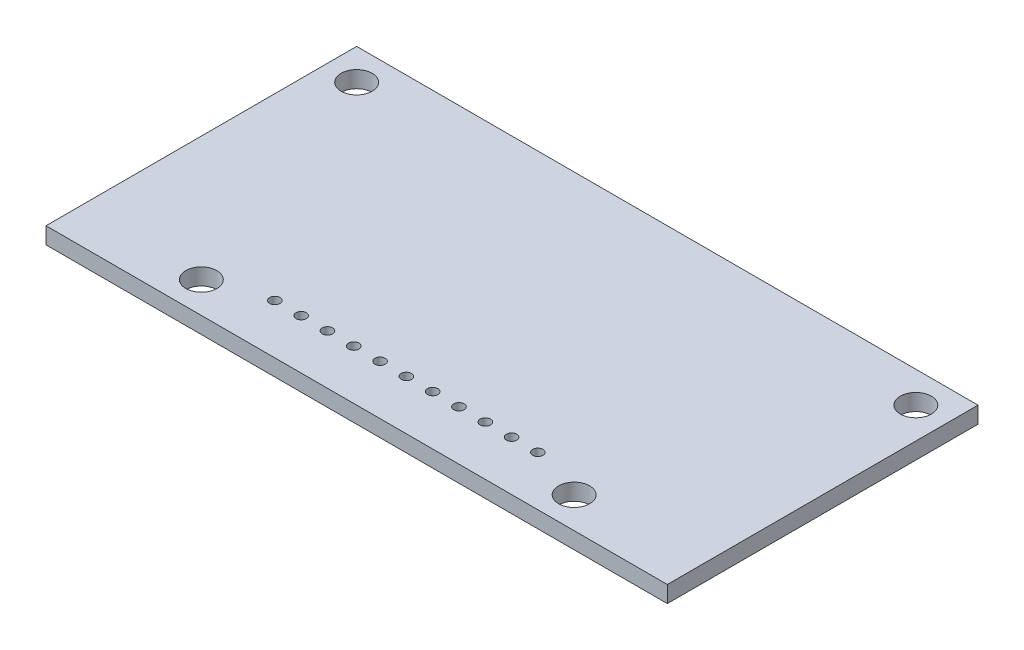
ISO-10303-21;
HEADER;
FILE_DESCRIPTION(('STEP AP214'),'2;1');
FILE_NAME('part.step','',(''),(''),'','','');
FILE_SCHEMA(('AUTOMOTIVE_DESIGN { 1 0 10303 214 1 1 1 1 }'));
ENDSEC;
DATA;
#1=APPLICATION_CONTEXT('core data for automotive mechanical design processes');
#2=APPLICATION_PROTOCOL_DEFINITION('international standard','automotive_design',2000,#1);
#3=PRODUCT_CONTEXT('',#1,'mechanical');
#4=PRODUCT('Part','Part','',(#3));
#5=PRODUCT_RELATED_PRODUCT_CATEGORY('part','',(#4));
#6=PRODUCT_DEFINITION_FORMATION('','',#4);
#7=PRODUCT_DEFINITION_CONTEXT('part definition',#1,'design');
#8=PRODUCT_DEFINITION('design','',#6,#7);
#9=PRODUCT_DEFINITION_SHAPE('','',#8);
#10=(LENGTH_UNIT() NAMED_UNIT(*) SI_UNIT(.MILLI.,.METRE.));
#11=(NAMED_UNIT(*) PLANE_ANGLE_UNIT() SI_UNIT($,.RADIAN.));
#12=(NAMED_UNIT(*) SI_UNIT($,.STERADIAN.) SOLID_ANGLE_UNIT());
#13=UNCERTAINTY_MEASURE_WITH_UNIT(LENGTH_MEASURE(1.E-05),#10,'distance_accuracy_value','');
#14=(GEOMETRIC_REPRESENTATION_CONTEXT(3) GLOBAL_UNCERTAINTY_ASSIGNED_CONTEXT((#13)) GLOBAL_UNIT_ASSIGNED_CONTEXT((#10,
#11,#12)) REPRESENTATION_CONTEXT('',''));
#15=CARTESIAN_POINT('',(0.,0.,0.));
#16=DIRECTION('',(0.,0.,1.));
#17=DIRECTION('',(1.,0.,0.));
#18=AXIS2_PLACEMENT_3D('',#15,#16,#17);
#19=CARTESIAN_POINT('',(0.,1.6,0.));
#20=DIRECTION('',(0.,-1.,0.));
#21=DIRECTION('',(0.,0.,-1.));
#22=AXIS2_PLACEMENT_3D('',#19,#20,#21);
#23=PLANE('',#22);
#24=DIRECTION('',(0.,0.,1.));
#25=VECTOR('',#24,1.);
#26=CARTESIAN_POINT('',(-30.,1.6,-15.));
#27=LINE('',#26,#25);
#28=CARTESIAN_POINT('',(-30.,1.6,-15.));
#29=VERTEX_POINT('',#28);
#30=CARTESIAN_POINT('',(-30.,1.6,15.));
#31=VERTEX_POINT('',#30);
#32=EDGE_CURVE('E94',#29,#31,#27,.T.);
#33=ORIENTED_EDGE('',*,*,#32,.T.);
#34=DIRECTION('',(1.,0.,0.));
#35=VECTOR('',#34,1.);
#36=CARTESIAN_POINT('',(30.,1.6,15.));
#37=LINE('',#36,#35);
#38=CARTESIAN_POINT('',(30.,1.6,15.));
#39=VERTEX_POINT('',#38);
#40=EDGE_CURVE('E89',#31,#39,#37,.T.);
#41=ORIENTED_EDGE('',*,*,#40,.T.);
#42=DIRECTION('',(0.,0.,-1.));
#43=VECTOR('',#42,1.);
#44=CARTESIAN_POINT('',(30.,1.6,-15.));
#45=LINE('',#44,#43);
#46=CARTESIAN_POINT('',(30.,1.6,-15.));
#47=VERTEX_POINT('',#46);
#48=EDGE_CURVE('E92',#39,#47,#45,.T.);
#49=ORIENTED_EDGE('',*,*,#48,.T.);
#50=DIRECTION('',(-1.,0.,0.));
#51=VECTOR('',#50,1.);
#52=CARTESIAN_POINT('',(30.,1.6,-15.));
#53=LINE('',#52,#51);
#54=EDGE_CURVE('E59',#47,#29,#53,.T.);
#55=ORIENTED_EDGE('',*,*,#54,.T.);
#56=EDGE_LOOP('',(#33,#41,#49,#55));
#57=FACE_BOUND('',#56,.T.);
#58=CARTESIAN_POINT('',(-27.,1.6,-12.));
#59=DIRECTION('',(0.,1.,0.));
#60=DIRECTION('',(0.,0.,1.));
#61=AXIS2_PLACEMENT_3D('',#58,#59,#60);
#62=CIRCLE('',#61,1.5);
#63=CARTESIAN_POINT('',(-27.,1.6,-10.5));
#64=VERTEX_POINT('',#63);
#65=EDGE_CURVE('E114',#64,#64,#62,.T.);
#66=ORIENTED_EDGE('',*,*,#65,.F.);
#67=EDGE_LOOP('',(#66));
#68=FACE_BOUND('',#67,.T.);
#69=CARTESIAN_POINT('',(-18.,1.6,12.));
#70=DIRECTION('',(0.,1.,0.));
#71=DIRECTION('',(0.,0.,1.));
#72=AXIS2_PLACEMENT_3D('',#69,#70,#71);
#73=CIRCLE('',#72,1.5);
#74=CARTESIAN_POINT('',(-18.,1.6,13.5));
#75=VERTEX_POINT('',#74);
#76=EDGE_CURVE('E136',#75,#75,#73,.T.);
#77=ORIENTED_EDGE('',*,*,#76,.F.);
#78=EDGE_LOOP('',(#77));
#79=FACE_BOUND('',#78,.T.);
#80=CARTESIAN_POINT('',(18.,1.6,12.));
#81=DIRECTION('',(0.,1.,0.));
#82=DIRECTION('',(0.,0.,1.));
#83=AXIS2_PLACEMENT_3D('',#80,#81,#82);
#84=CIRCLE('',#83,1.5);
#85=CARTESIAN_POINT('',(18.,1.6,13.5));
#86=VERTEX_POINT('',#85);
#87=EDGE_CURVE('E144',#86,#86,#84,.T.);
#88=ORIENTED_EDGE('',*,*,#87,.F.);
#89=EDGE_LOOP('',(#88));
#90=FACE_BOUND('',#89,.T.);
#91=CARTESIAN_POINT('',(27.,1.6,-12.));
#92=DIRECTION('',(0.,1.,0.));
#93=DIRECTION('',(0.,0.,1.));
#94=AXIS2_PLACEMENT_3D('',#91,#92,#93);
#95=CIRCLE('',#94,1.5);
#96=CARTESIAN_POINT('',(27.,1.6,-10.5));
#97=VERTEX_POINT('',#96);
#98=EDGE_CURVE('E152',#97,#97,#95,.T.);
#99=ORIENTED_EDGE('',*,*,#98,.F.);
#100=EDGE_LOOP('',(#99));
#101=FACE_BOUND('',#100,.T.);
#102=CARTESIAN_POINT('',(-12.7,1.6,10.2));
#103=DIRECTION('',(0.,1.,0.));
#104=DIRECTION('',(0.,0.,1.));
#105=AXIS2_PLACEMENT_3D('',#102,#103,#104);
#106=CIRCLE('',#105,0.500000000000001);
#107=CARTESIAN_POINT('',(-12.7,1.6,10.7));
#108=VERTEX_POINT('',#107);
#109=EDGE_CURVE('E160',#108,#108,#106,.T.);
#110=ORIENTED_EDGE('',*,*,#109,.F.);
#111=EDGE_LOOP('',(#110));
#112=FACE_BOUND('',#111,.T.);
#113=CARTESIAN_POINT('',(-10.16,1.6,10.2));
#114=DIRECTION('',(0.,1.,0.));
#115=DIRECTION('',(0.,0.,1.));
#116=AXIS2_PLACEMENT_3D('',#113,#114,#115);
#117=CIRCLE('',#116,0.500000000000001);
#118=CARTESIAN_POINT('',(-10.16,1.6,10.7));
#119=VERTEX_POINT('',#118);
#120=EDGE_CURVE('E168',#119,#119,#117,.T.);
#121=ORIENTED_EDGE('',*,*,#120,.F.);
#122=EDGE_LOOP('',(#121));
#123=FACE_BOUND('',#122,.T.);
#124=CARTESIAN_POINT('',(-7.62,1.6,10.2));
#125=DIRECTION('',(0.,1.,0.));
#126=DIRECTION('',(0.,0.,1.));
#127=AXIS2_PLACEMENT_3D('',#124,#125,#126);
#128=CIRCLE('',#127,0.500000000000002);
#129=CARTESIAN_POINT('',(-7.62,1.6,10.7));
#130=VERTEX_POINT('',#129);
#131=EDGE_CURVE('E176',#130,#130,#128,.T.);
#132=ORIENTED_EDGE('',*,*,#131,.F.);
#133=EDGE_LOOP('',(#132));
#134=FACE_BOUND('',#133,.T.);
#135=CARTESIAN_POINT('',(-5.08,1.6,10.2));
#136=DIRECTION('',(0.,1.,0.));
#137=DIRECTION('',(0.,0.,1.));
#138=AXIS2_PLACEMENT_3D('',#135,#136,#137);
#139=CIRCLE('',#138,0.500000000000001);
#140=CARTESIAN_POINT('',(-5.08,1.6,10.7));
#141=VERTEX_POINT('',#140);
#142=EDGE_CURVE('E184',#141,#141,#139,.T.);
#143=ORIENTED_EDGE('',*,*,#142,.F.);
#144=EDGE_LOOP('',(#143));
#145=FACE_BOUND('',#144,.T.);
#146=CARTESIAN_POINT('',(-2.54,1.6,10.2));
#147=DIRECTION('',(0.,1.,0.));
#148=DIRECTION('',(0.,0.,1.));
#149=AXIS2_PLACEMENT_3D('',#146,#147,#148);
#150=CIRCLE('',#149,0.5);
#151=CARTESIAN_POINT('',(-2.54,1.6,10.7));
#152=VERTEX_POINT('',#151);
#153=EDGE_CURVE('E192',#152,#152,#150,.T.);
#154=ORIENTED_EDGE('',*,*,#153,.F.);
#155=EDGE_LOOP('',(#154));
#156=FACE_BOUND('',#155,.T.);
#157=CARTESIAN_POINT('',(0.,1.6,10.2));
#158=DIRECTION('',(0.,1.,0.));
#159=DIRECTION('',(0.,0.,1.));
#160=AXIS2_PLACEMENT_3D('',#157,#158,#159);
#161=CIRCLE('',#160,0.5);
#162=CARTESIAN_POINT('',(0.,1.6,10.7));
#163=VERTEX_POINT('',#162);
#164=EDGE_CURVE('E200',#163,#163,#161,.T.);
#165=ORIENTED_EDGE('',*,*,#164,.F.);
#166=EDGE_LOOP('',(#165));
#167=FACE_BOUND('',#166,.T.);
#168=CARTESIAN_POINT('',(2.54,1.6,10.2));
#169=DIRECTION('',(0.,1.,0.));
#170=DIRECTION('',(0.,0.,1.));
#171=AXIS2_PLACEMENT_3D('',#168,#169,#170);
#172=CIRCLE('',#171,0.5);
#173=CARTESIAN_POINT('',(2.54,1.6,10.7));
#174=VERTEX_POINT('',#173);
#175=EDGE_CURVE('E208',#174,#174,#172,.T.);
#176=ORIENTED_EDGE('',*,*,#175,.F.);
#177=EDGE_LOOP('',(#176));
#178=FACE_BOUND('',#177,.T.);
#179=CARTESIAN_POINT('',(5.08,1.6,10.2));
#180=DIRECTION('',(0.,1.,0.));
#181=DIRECTION('',(0.,0.,1.));
#182=AXIS2_PLACEMENT_3D('',#179,#180,#181);
#183=CIRCLE('',#182,0.500000000000001);
#184=CARTESIAN_POINT('',(5.08,1.6,10.7));
#185=VERTEX_POINT('',#184);
#186=EDGE_CURVE('E216',#185,#185,#183,.T.);
#187=ORIENTED_EDGE('',*,*,#186,.F.);
#188=EDGE_LOOP('',(#187));
#189=FACE_BOUND('',#188,.T.);
#190=CARTESIAN_POINT('',(7.62,1.6,10.2));
#191=DIRECTION('',(0.,1.,0.));
#192=DIRECTION('',(0.,0.,1.));
#193=AXIS2_PLACEMENT_3D('',#190,#191,#192);
#194=CIRCLE('',#193,0.500000000000001);
#195=CARTESIAN_POINT('',(7.62,1.6,10.7));
#196=VERTEX_POINT('',#195);
#197=EDGE_CURVE('E224',#196,#196,#194,.T.);
#198=ORIENTED_EDGE('',*,*,#197,.F.);
#199=EDGE_LOOP('',(#198));
#200=FACE_BOUND('',#199,.T.);
#201=CARTESIAN_POINT('',(10.16,1.6,10.2));
#202=DIRECTION('',(0.,1.,0.));
#203=DIRECTION('',(0.,0.,1.));
#204=AXIS2_PLACEMENT_3D('',#201,#202,#203);
#205=CIRCLE('',#204,0.500000000000001);
#206=CARTESIAN_POINT('',(10.16,1.6,10.7));
#207=VERTEX_POINT('',#206);
#208=EDGE_CURVE('E232',#207,#207,#205,.T.);
#209=ORIENTED_EDGE('',*,*,#208,.F.);
#210=EDGE_LOOP('',(#209));
#211=FACE_BOUND('',#210,.T.);
#212=CARTESIAN_POINT('',(12.7,1.6,10.2));
#213=DIRECTION('',(0.,1.,0.));
#214=DIRECTION('',(0.,0.,1.));
#215=AXIS2_PLACEMENT_3D('',#212,#213,#214);
#216=CIRCLE('',#215,0.500000000000001);
#217=CARTESIAN_POINT('',(12.7,1.6,10.7));
#218=VERTEX_POINT('',#217);
#219=EDGE_CURVE('E240',#218,#218,#216,.T.);
#220=ORIENTED_EDGE('',*,*,#219,.F.);
#221=EDGE_LOOP('',(#220));
#222=FACE_BOUND('',#221,.T.);
#223=ADVANCED_FACE('F41',(#57,#68,#79,#90,#101,#112,#123,#134,#145,#156,#167,#178,#189,#200,
#211,#222),#23,.F.);
#224=CARTESIAN_POINT('',(0.,0.,0.));
#225=DIRECTION('',(0.,-1.,0.));
#226=DIRECTION('',(0.,0.,-1.));
#227=AXIS2_PLACEMENT_3D('',#224,#225,#226);
#228=PLANE('',#227);
#229=CARTESIAN_POINT('',(10.16,0.,10.2));
#230=DIRECTION('',(0.,1.,0.));
#231=DIRECTION('',(0.,0.,1.));
#232=AXIS2_PLACEMENT_3D('',#229,#230,#231);
#233=CIRCLE('',#232,0.500000000000001);
#234=CARTESIAN_POINT('',(10.16,0.,10.7));
#235=VERTEX_POINT('',#234);
#236=EDGE_CURVE('E236',#235,#235,#233,.T.);
#237=ORIENTED_EDGE('',*,*,#236,.T.);
#238=EDGE_LOOP('',(#237));
#239=FACE_BOUND('',#238,.T.);
#240=CARTESIAN_POINT('',(5.08,0.,10.2));
#241=DIRECTION('',(0.,1.,0.));
#242=DIRECTION('',(0.,0.,1.));
#243=AXIS2_PLACEMENT_3D('',#240,#241,#242);
#244=CIRCLE('',#243,0.500000000000001);
#245=CARTESIAN_POINT('',(5.08,0.,10.7));
#246=VERTEX_POINT('',#245);
#247=EDGE_CURVE('E220',#246,#246,#244,.T.);
#248=ORIENTED_EDGE('',*,*,#247,.T.);
#249=EDGE_LOOP('',(#248));
#250=FACE_BOUND('',#249,.T.);
#251=CARTESIAN_POINT('',(0.,0.,10.2));
#252=DIRECTION('',(0.,1.,0.));
#253=DIRECTION('',(0.,0.,1.));
#254=AXIS2_PLACEMENT_3D('',#251,#252,#253);
#255=CIRCLE('',#254,0.5);
#256=CARTESIAN_POINT('',(0.,0.,10.7));
#257=VERTEX_POINT('',#256);
#258=EDGE_CURVE('E204',#257,#257,#255,.T.);
#259=ORIENTED_EDGE('',*,*,#258,.T.);
#260=EDGE_LOOP('',(#259));
#261=FACE_BOUND('',#260,.T.);
#262=CARTESIAN_POINT('',(-5.08,0.,10.2));
#263=DIRECTION('',(0.,1.,0.));
#264=DIRECTION('',(0.,0.,1.));
#265=AXIS2_PLACEMENT_3D('',#262,#263,#264);
#266=CIRCLE('',#265,0.500000000000001);
#267=CARTESIAN_POINT('',(-5.08,0.,10.7));
#268=VERTEX_POINT('',#267);
#269=EDGE_CURVE('E188',#268,#268,#266,.T.);
#270=ORIENTED_EDGE('',*,*,#269,.T.);
#271=EDGE_LOOP('',(#270));
#272=FACE_BOUND('',#271,.T.);
#273=CARTESIAN_POINT('',(-10.16,0.,10.2));
#274=DIRECTION('',(0.,1.,0.));
#275=DIRECTION('',(0.,0.,1.));
#276=AXIS2_PLACEMENT_3D('',#273,#274,#275);
#277=CIRCLE('',#276,0.500000000000001);
#278=CARTESIAN_POINT('',(-10.16,0.,10.7));
#279=VERTEX_POINT('',#278);
#280=EDGE_CURVE('E172',#279,#279,#277,.T.);
#281=ORIENTED_EDGE('',*,*,#280,.T.);
#282=EDGE_LOOP('',(#281));
#283=FACE_BOUND('',#282,.T.);
#284=CARTESIAN_POINT('',(27.,0.,-12.));
#285=DIRECTION('',(0.,1.,0.));
#286=DIRECTION('',(0.,0.,1.));
#287=AXIS2_PLACEMENT_3D('',#284,#285,#286);
#288=CIRCLE('',#287,1.5);
#289=CARTESIAN_POINT('',(27.,0.,-10.5));
#290=VERTEX_POINT('',#289);
#291=EDGE_CURVE('E156',#290,#290,#288,.T.);
#292=ORIENTED_EDGE('',*,*,#291,.T.);
#293=EDGE_LOOP('',(#292));
#294=FACE_BOUND('',#293,.T.);
#295=CARTESIAN_POINT('',(-18.,0.,12.));
#296=DIRECTION('',(0.,1.,0.));
#297=DIRECTION('',(0.,0.,1.));
#298=AXIS2_PLACEMENT_3D('',#295,#296,#297);
#299=CIRCLE('',#298,1.5);
#300=CARTESIAN_POINT('',(-18.,0.,13.5));
#301=VERTEX_POINT('',#300);
#302=EDGE_CURVE('E140',#301,#301,#299,.T.);
#303=ORIENTED_EDGE('',*,*,#302,.T.);
#304=EDGE_LOOP('',(#303));
#305=FACE_BOUND('',#304,.T.);
#306=DIRECTION('',(0.,0.,1.));
#307=VECTOR('',#306,1.);
#308=CARTESIAN_POINT('',(-30.,0.,-15.));
#309=LINE('',#308,#307);
#310=CARTESIAN_POINT('',(-30.,0.,-15.));
#311=VERTEX_POINT('',#310);
#312=CARTESIAN_POINT('',(-30.,0.,15.));
#313=VERTEX_POINT('',#312);
#314=EDGE_CURVE('E110',#311,#313,#309,.T.);
#315=ORIENTED_EDGE('',*,*,#314,.F.);
#316=DIRECTION('',(-1.,0.,0.));
#317=VECTOR('',#316,1.);
#318=CARTESIAN_POINT('',(30.,0.,-15.));
#319=LINE('',#318,#317);
#320=CARTESIAN_POINT('',(30.,0.,-15.));
#321=VERTEX_POINT('',#320);
#322=EDGE_CURVE('E82',#321,#311,#319,.T.);
#323=ORIENTED_EDGE('',*,*,#322,.F.);
#324=DIRECTION('',(0.,0.,-1.));
#325=VECTOR('',#324,1.);
#326=CARTESIAN_POINT('',(30.,0.,-15.));
#327=LINE('',#326,#325);
#328=CARTESIAN_POINT('',(30.,0.,15.));
#329=VERTEX_POINT('',#328);
#330=EDGE_CURVE('E76',#329,#321,#327,.T.);
#331=ORIENTED_EDGE('',*,*,#330,.F.);
#332=DIRECTION('',(1.,0.,0.));
#333=VECTOR('',#332,1.);
#334=CARTESIAN_POINT('',(30.,0.,15.));
#335=LINE('',#334,#333);
#336=EDGE_CURVE('E99',#313,#329,#335,.T.);
#337=ORIENTED_EDGE('',*,*,#336,.F.);
#338=EDGE_LOOP('',(#315,#323,#331,#337));
#339=FACE_BOUND('',#338,.T.);
#340=CARTESIAN_POINT('',(-27.,0.,-12.));
#341=DIRECTION('',(0.,1.,0.));
#342=DIRECTION('',(0.,0.,1.));
#343=AXIS2_PLACEMENT_3D('',#340,#341,#342);
#344=CIRCLE('',#343,1.5);
#345=CARTESIAN_POINT('',(-27.,0.,-10.5));
#346=VERTEX_POINT('',#345);
#347=EDGE_CURVE('E132',#346,#346,#344,.T.);
#348=ORIENTED_EDGE('',*,*,#347,.T.);
#349=EDGE_LOOP('',(#348));
#350=FACE_BOUND('',#349,.T.);
#351=CARTESIAN_POINT('',(18.,0.,12.));
#352=DIRECTION('',(0.,1.,0.));
#353=DIRECTION('',(0.,0.,1.));
#354=AXIS2_PLACEMENT_3D('',#351,#352,#353);
#355=CIRCLE('',#354,1.5);
#356=CARTESIAN_POINT('',(18.,0.,13.5));
#357=VERTEX_POINT('',#356);
#358=EDGE_CURVE('E148',#357,#357,#355,.T.);
#359=ORIENTED_EDGE('',*,*,#358,.T.);
#360=EDGE_LOOP('',(#359));
#361=FACE_BOUND('',#360,.T.);
#362=CARTESIAN_POINT('',(-12.7,0.,10.2));
#363=DIRECTION('',(0.,1.,0.));
#364=DIRECTION('',(0.,0.,1.));
#365=AXIS2_PLACEMENT_3D('',#362,#363,#364);
#366=CIRCLE('',#365,0.500000000000001);
#367=CARTESIAN_POINT('',(-12.7,0.,10.7));
#368=VERTEX_POINT('',#367);
#369=EDGE_CURVE('E164',#368,#368,#366,.T.);
#370=ORIENTED_EDGE('',*,*,#369,.T.);
#371=EDGE_LOOP('',(#370));
#372=FACE_BOUND('',#371,.T.);
#373=CARTESIAN_POINT('',(-7.62,0.,10.2));
#374=DIRECTION('',(0.,1.,0.));
#375=DIRECTION('',(0.,0.,1.));
#376=AXIS2_PLACEMENT_3D('',#373,#374,#375);
#377=CIRCLE('',#376,0.500000000000002);
#378=CARTESIAN_POINT('',(-7.62,0.,10.7));
#379=VERTEX_POINT('',#378);
#380=EDGE_CURVE('E180',#379,#379,#377,.T.);
#381=ORIENTED_EDGE('',*,*,#380,.T.);
#382=EDGE_LOOP('',(#381));
#383=FACE_BOUND('',#382,.T.);
#384=CARTESIAN_POINT('',(-2.54,0.,10.2));
#385=DIRECTION('',(0.,1.,0.));
#386=DIRECTION('',(0.,0.,1.));
#387=AXIS2_PLACEMENT_3D('',#384,#385,#386);
#388=CIRCLE('',#387,0.5);
#389=CARTESIAN_POINT('',(-2.54,0.,10.7));
#390=VERTEX_POINT('',#389);
#391=EDGE_CURVE('E196',#390,#390,#388,.T.);
#392=ORIENTED_EDGE('',*,*,#391,.T.);
#393=EDGE_LOOP('',(#392));
#394=FACE_BOUND('',#393,.T.);
#395=CARTESIAN_POINT('',(2.54,0.,10.2));
#396=DIRECTION('',(0.,1.,0.));
#397=DIRECTION('',(0.,0.,1.));
#398=AXIS2_PLACEMENT_3D('',#395,#396,#397);
#399=CIRCLE('',#398,0.5);
#400=CARTESIAN_POINT('',(2.54,0.,10.7));
#401=VERTEX_POINT('',#400);
#402=EDGE_CURVE('E212',#401,#401,#399,.T.);
#403=ORIENTED_EDGE('',*,*,#402,.T.);
#404=EDGE_LOOP('',(#403));
#405=FACE_BOUND('',#404,.T.);
#406=CARTESIAN_POINT('',(7.62,0.,10.2));
#407=DIRECTION('',(0.,1.,0.));
#408=DIRECTION('',(0.,0.,1.));
#409=AXIS2_PLACEMENT_3D('',#406,#407,#408);
#410=CIRCLE('',#409,0.500000000000001);
#411=CARTESIAN_POINT('',(7.62,0.,10.7));
#412=VERTEX_POINT('',#411);
#413=EDGE_CURVE('E228',#412,#412,#410,.T.);
#414=ORIENTED_EDGE('',*,*,#413,.T.);
#415=EDGE_LOOP('',(#414));
#416=FACE_BOUND('',#415,.T.);
#417=CARTESIAN_POINT('',(12.7,0.,10.2));
#418=DIRECTION('',(0.,1.,0.));
#419=DIRECTION('',(0.,0.,1.));
#420=AXIS2_PLACEMENT_3D('',#417,#418,#419);
#421=CIRCLE('',#420,0.500000000000001);
#422=CARTESIAN_POINT('',(12.7,0.,10.7));
#423=VERTEX_POINT('',#422);
#424=EDGE_CURVE('E244',#423,#423,#421,.T.);
#425=ORIENTED_EDGE('',*,*,#424,.T.);
#426=EDGE_LOOP('',(#425));
#427=FACE_BOUND('',#426,.T.);
#428=ADVANCED_FACE('F127',(#239,#250,#261,#272,#283,#294,#305,#339,#350,#361,#372,#383,#394,
#405,#416,#427),#228,.T.);
#429=CARTESIAN_POINT('',(-30.,1.6,-15.));
#430=DIRECTION('',(1.,0.,0.));
#431=DIRECTION('',(0.,0.,-1.));
#432=AXIS2_PLACEMENT_3D('',#429,#430,#431);
#433=PLANE('',#432);
#434=ORIENTED_EDGE('',*,*,#314,.T.);
#435=DIRECTION('',(0.,-1.,0.));
#436=VECTOR('',#435,1.);
#437=CARTESIAN_POINT('',(-30.,1.6,15.));
#438=LINE('',#437,#436);
#439=EDGE_CURVE('E11',#31,#313,#438,.T.);
#440=ORIENTED_EDGE('',*,*,#439,.F.);
#441=ORIENTED_EDGE('',*,*,#32,.F.);
#442=DIRECTION('',(0.,-1.,0.));
#443=VECTOR('',#442,1.);
#444=CARTESIAN_POINT('',(-30.,1.6,-15.));
#445=LINE('',#444,#443);
#446=EDGE_CURVE('E106',#29,#311,#445,.T.);
#447=ORIENTED_EDGE('',*,*,#446,.T.);
#448=EDGE_LOOP('',(#434,#440,#441,#447));
#449=FACE_BOUND('',#448,.T.);
#450=ADVANCED_FACE('F43',(#449),#433,.F.);
#451=CARTESIAN_POINT('',(30.,1.6,15.));
#452=DIRECTION('',(0.,0.,-1.));
#453=DIRECTION('',(-1.,0.,0.));
#454=AXIS2_PLACEMENT_3D('',#451,#452,#453);
#455=PLANE('',#454);
#456=ORIENTED_EDGE('',*,*,#336,.T.);
#457=DIRECTION('',(0.,-1.,0.));
#458=VECTOR('',#457,1.);
#459=CARTESIAN_POINT('',(30.,1.6,15.));
#460=LINE('',#459,#458);
#461=EDGE_CURVE('E51',#39,#329,#460,.T.);
#462=ORIENTED_EDGE('',*,*,#461,.F.);
#463=ORIENTED_EDGE('',*,*,#40,.F.);
#464=ORIENTED_EDGE('',*,*,#439,.T.);
#465=EDGE_LOOP('',(#456,#462,#463,#464));
#466=FACE_BOUND('',#465,.T.);
#467=ADVANCED_FACE('F98',(#466),#455,.F.);
#468=CARTESIAN_POINT('',(30.,1.6,-15.));
#469=DIRECTION('',(-1.,0.,0.));
#470=DIRECTION('',(0.,0.,1.));
#471=AXIS2_PLACEMENT_3D('',#468,#469,#470);
#472=PLANE('',#471);
#473=ORIENTED_EDGE('',*,*,#330,.T.);
#474=DIRECTION('',(0.,-1.,0.));
#475=VECTOR('',#474,1.);
#476=CARTESIAN_POINT('',(30.,1.6,-15.));
#477=LINE('',#476,#475);
#478=EDGE_CURVE('E101',#47,#321,#477,.T.);
#479=ORIENTED_EDGE('',*,*,#478,.F.);
#480=ORIENTED_EDGE('',*,*,#48,.F.);
#481=ORIENTED_EDGE('',*,*,#461,.T.);
#482=EDGE_LOOP('',(#473,#479,#480,#481));
#483=FACE_BOUND('',#482,.T.);
#484=ADVANCED_FACE('F102',(#483),#472,.F.);
#485=CARTESIAN_POINT('',(30.,1.6,-15.));
#486=DIRECTION('',(0.,0.,1.));
#487=DIRECTION('',(1.,0.,0.));
#488=AXIS2_PLACEMENT_3D('',#485,#486,#487);
#489=PLANE('',#488);
#490=ORIENTED_EDGE('',*,*,#322,.T.);
#491=ORIENTED_EDGE('',*,*,#446,.F.);
#492=ORIENTED_EDGE('',*,*,#54,.F.);
#493=ORIENTED_EDGE('',*,*,#478,.T.);
#494=EDGE_LOOP('',(#490,#491,#492,#493));
#495=FACE_BOUND('',#494,.T.);
#496=ADVANCED_FACE('F124',(#495),#489,.F.);
#497=CARTESIAN_POINT('',(-27.,1.6,-12.));
#498=DIRECTION('',(0.,-1.,0.));
#499=DIRECTION('',(0.,0.,-1.));
#500=AXIS2_PLACEMENT_3D('',#497,#498,#499);
#501=CYLINDRICAL_SURFACE('',#500,1.5);
#502=ORIENTED_EDGE('',*,*,#65,.T.);
#503=EDGE_LOOP('',(#502));
#504=FACE_BOUND('',#503,.T.);
#505=ORIENTED_EDGE('',*,*,#347,.F.);
#506=EDGE_LOOP('',(#505));
#507=FACE_BOUND('',#506,.T.);
#508=ADVANCED_FACE('F263',(#504,#507),#501,.F.);
#509=CARTESIAN_POINT('',(-18.,1.6,12.));
#510=DIRECTION('',(0.,-1.,0.));
#511=DIRECTION('',(0.,0.,-1.));
#512=AXIS2_PLACEMENT_3D('',#509,#510,#511);
#513=CYLINDRICAL_SURFACE('',#512,1.5);
#514=ORIENTED_EDGE('',*,*,#76,.T.);
#515=EDGE_LOOP('',(#514));
#516=FACE_BOUND('',#515,.T.);
#517=ORIENTED_EDGE('',*,*,#302,.F.);
#518=EDGE_LOOP('',(#517));
#519=FACE_BOUND('',#518,.T.);
#520=ADVANCED_FACE('F309',(#516,#519),#513,.F.);
#521=CARTESIAN_POINT('',(18.,1.6,12.));
#522=DIRECTION('',(0.,-1.,0.));
#523=DIRECTION('',(0.,0.,-1.));
#524=AXIS2_PLACEMENT_3D('',#521,#522,#523);
#525=CYLINDRICAL_SURFACE('',#524,1.5);
#526=ORIENTED_EDGE('',*,*,#87,.T.);
#527=EDGE_LOOP('',(#526));
#528=FACE_BOUND('',#527,.T.);
#529=ORIENTED_EDGE('',*,*,#358,.F.);
#530=EDGE_LOOP('',(#529));
#531=FACE_BOUND('',#530,.T.);
#532=ADVANCED_FACE('F317',(#528,#531),#525,.F.);
#533=CARTESIAN_POINT('',(27.,1.6,-12.));
#534=DIRECTION('',(0.,-1.,0.));
#535=DIRECTION('',(0.,0.,-1.));
#536=AXIS2_PLACEMENT_3D('',#533,#534,#535);
#537=CYLINDRICAL_SURFACE('',#536,1.5);
#538=ORIENTED_EDGE('',*,*,#98,.T.);
#539=EDGE_LOOP('',(#538));
#540=FACE_BOUND('',#539,.T.);
#541=ORIENTED_EDGE('',*,*,#291,.F.);
#542=EDGE_LOOP('',(#541));
#543=FACE_BOUND('',#542,.T.);
#544=ADVANCED_FACE('F325',(#540,#543),#537,.F.);
#545=CARTESIAN_POINT('',(-12.7,1.6,10.2));
#546=DIRECTION('',(0.,-1.,0.));
#547=DIRECTION('',(0.,0.,-1.));
#548=AXIS2_PLACEMENT_3D('',#545,#546,#547);
#549=CYLINDRICAL_SURFACE('',#548,0.500000000000001);
#550=ORIENTED_EDGE('',*,*,#109,.T.);
#551=EDGE_LOOP('',(#550));
#552=FACE_BOUND('',#551,.T.);
#553=ORIENTED_EDGE('',*,*,#369,.F.);
#554=EDGE_LOOP('',(#553));
#555=FACE_BOUND('',#554,.T.);
#556=ADVANCED_FACE('F334',(#552,#555),#549,.F.);
#557=CARTESIAN_POINT('',(-10.16,1.6,10.2));
#558=DIRECTION('',(0.,-1.,0.));
#559=DIRECTION('',(0.,0.,-1.));
#560=AXIS2_PLACEMENT_3D('',#557,#558,#559);
#561=CYLINDRICAL_SURFACE('',#560,0.500000000000001);
#562=ORIENTED_EDGE('',*,*,#120,.T.);
#563=EDGE_LOOP('',(#562));
#564=FACE_BOUND('',#563,.T.);
#565=ORIENTED_EDGE('',*,*,#280,.F.);
#566=EDGE_LOOP('',(#565));
#567=FACE_BOUND('',#566,.T.);
#568=ADVANCED_FACE('F343',(#564,#567),#561,.F.);
#569=CARTESIAN_POINT('',(-7.62,1.6,10.2));
#570=DIRECTION('',(0.,-1.,0.));
#571=DIRECTION('',(0.,0.,-1.));
#572=AXIS2_PLACEMENT_3D('',#569,#570,#571);
#573=CYLINDRICAL_SURFACE('',#572,0.500000000000002);
#574=ORIENTED_EDGE('',*,*,#131,.T.);
#575=EDGE_LOOP('',(#574));
#576=FACE_BOUND('',#575,.T.);
#577=ORIENTED_EDGE('',*,*,#380,.F.);
#578=EDGE_LOOP('',(#577));
#579=FACE_BOUND('',#578,.T.);
#580=ADVANCED_FACE('F352',(#576,#579),#573,.F.);
#581=CARTESIAN_POINT('',(-5.08,1.6,10.2));
#582=DIRECTION('',(0.,-1.,0.));
#583=DIRECTION('',(0.,0.,-1.));
#584=AXIS2_PLACEMENT_3D('',#581,#582,#583);
#585=CYLINDRICAL_SURFACE('',#584,0.500000000000001);
#586=ORIENTED_EDGE('',*,*,#142,.T.);
#587=EDGE_LOOP('',(#586));
#588=FACE_BOUND('',#587,.T.);
#589=ORIENTED_EDGE('',*,*,#269,.F.);
#590=EDGE_LOOP('',(#589));
#591=FACE_BOUND('',#590,.T.);
#592=ADVANCED_FACE('F361',(#588,#591),#585,.F.);
#593=CARTESIAN_POINT('',(-2.54,1.6,10.2));
#594=DIRECTION('',(0.,-1.,0.));
#595=DIRECTION('',(0.,0.,-1.));
#596=AXIS2_PLACEMENT_3D('',#593,#594,#595);
#597=CYLINDRICAL_SURFACE('',#596,0.5);
#598=ORIENTED_EDGE('',*,*,#153,.T.);
#599=EDGE_LOOP('',(#598));
#600=FACE_BOUND('',#599,.T.);
#601=ORIENTED_EDGE('',*,*,#391,.F.);
#602=EDGE_LOOP('',(#601));
#603=FACE_BOUND('',#602,.T.);
#604=ADVANCED_FACE('F370',(#600,#603),#597,.F.);
#605=CARTESIAN_POINT('',(0.,1.6,10.2));
#606=DIRECTION('',(0.,-1.,0.));
#607=DIRECTION('',(0.,0.,-1.));
#608=AXIS2_PLACEMENT_3D('',#605,#606,#607);
#609=CYLINDRICAL_SURFACE('',#608,0.5);
#610=ORIENTED_EDGE('',*,*,#164,.T.);
#611=EDGE_LOOP('',(#610));
#612=FACE_BOUND('',#611,.T.);
#613=ORIENTED_EDGE('',*,*,#258,.F.);
#614=EDGE_LOOP('',(#613));
#615=FACE_BOUND('',#614,.T.);
#616=ADVANCED_FACE('F379',(#612,#615),#609,.F.);
#617=CARTESIAN_POINT('',(2.54,1.6,10.2));
#618=DIRECTION('',(0.,-1.,0.));
#619=DIRECTION('',(0.,0.,-1.));
#620=AXIS2_PLACEMENT_3D('',#617,#618,#619);
#621=CYLINDRICAL_SURFACE('',#620,0.5);
#622=ORIENTED_EDGE('',*,*,#175,.T.);
#623=EDGE_LOOP('',(#622));
#624=FACE_BOUND('',#623,.T.);
#625=ORIENTED_EDGE('',*,*,#402,.F.);
#626=EDGE_LOOP('',(#625));
#627=FACE_BOUND('',#626,.T.);
#628=ADVANCED_FACE('F388',(#624,#627),#621,.F.);
#629=CARTESIAN_POINT('',(5.08,1.6,10.2));
#630=DIRECTION('',(0.,-1.,0.));
#631=DIRECTION('',(0.,0.,-1.));
#632=AXIS2_PLACEMENT_3D('',#629,#630,#631);
#633=CYLINDRICAL_SURFACE('',#632,0.500000000000001);
#634=ORIENTED_EDGE('',*,*,#186,.T.);
#635=EDGE_LOOP('',(#634));
#636=FACE_BOUND('',#635,.T.);
#637=ORIENTED_EDGE('',*,*,#247,.F.);
#638=EDGE_LOOP('',(#637));
#639=FACE_BOUND('',#638,.T.);
#640=ADVANCED_FACE('F397',(#636,#639),#633,.F.);
#641=CARTESIAN_POINT('',(7.62,1.6,10.2));
#642=DIRECTION('',(0.,-1.,0.));
#643=DIRECTION('',(0.,0.,-1.));
#644=AXIS2_PLACEMENT_3D('',#641,#642,#643);
#645=CYLINDRICAL_SURFACE('',#644,0.500000000000001);
#646=ORIENTED_EDGE('',*,*,#197,.T.);
#647=EDGE_LOOP('',(#646));
#648=FACE_BOUND('',#647,.T.);
#649=ORIENTED_EDGE('',*,*,#413,.F.);
#650=EDGE_LOOP('',(#649));
#651=FACE_BOUND('',#650,.T.);
#652=ADVANCED_FACE('F406',(#648,#651),#645,.F.);
#653=CARTESIAN_POINT('',(10.16,1.6,10.2));
#654=DIRECTION('',(0.,-1.,0.));
#655=DIRECTION('',(0.,0.,-1.));
#656=AXIS2_PLACEMENT_3D('',#653,#654,#655);
#657=CYLINDRICAL_SURFACE('',#656,0.500000000000001);
#658=ORIENTED_EDGE('',*,*,#208,.T.);
#659=EDGE_LOOP('',(#658));
#660=FACE_BOUND('',#659,.T.);
#661=ORIENTED_EDGE('',*,*,#236,.F.);
#662=EDGE_LOOP('',(#661));
#663=FACE_BOUND('',#662,.T.);
#664=ADVANCED_FACE('F415',(#660,#663),#657,.F.);
#665=CARTESIAN_POINT('',(12.7,1.6,10.2));
#666=DIRECTION('',(0.,-1.,0.));
#667=DIRECTION('',(0.,0.,-1.));
#668=AXIS2_PLACEMENT_3D('',#665,#666,#667);
#669=CYLINDRICAL_SURFACE('',#668,0.500000000000001);
#670=ORIENTED_EDGE('',*,*,#219,.T.);
#671=EDGE_LOOP('',(#670));
#672=FACE_BOUND('',#671,.T.);
#673=ORIENTED_EDGE('',*,*,#424,.F.);
#674=EDGE_LOOP('',(#673));
#675=FACE_BOUND('',#674,.T.);
#676=ADVANCED_FACE('F252',(#672,#675),#669,.F.);
#677=CLOSED_SHELL('',(#223,#428,#450,#467,#484,#496,#508,#520,#532,#544,#556,#568,#580,#592,
#604,#616,#628,#640,#652,#664,#676));
#678=MANIFOLD_SOLID_BREP('B2',#677);
#679=ADVANCED_BREP_SHAPE_REPRESENTATION('',(#18,#678),#14);
#680=SHAPE_DEFINITION_REPRESENTATION(#9,#679);
ENDSEC;
END-ISO-10303-21;
